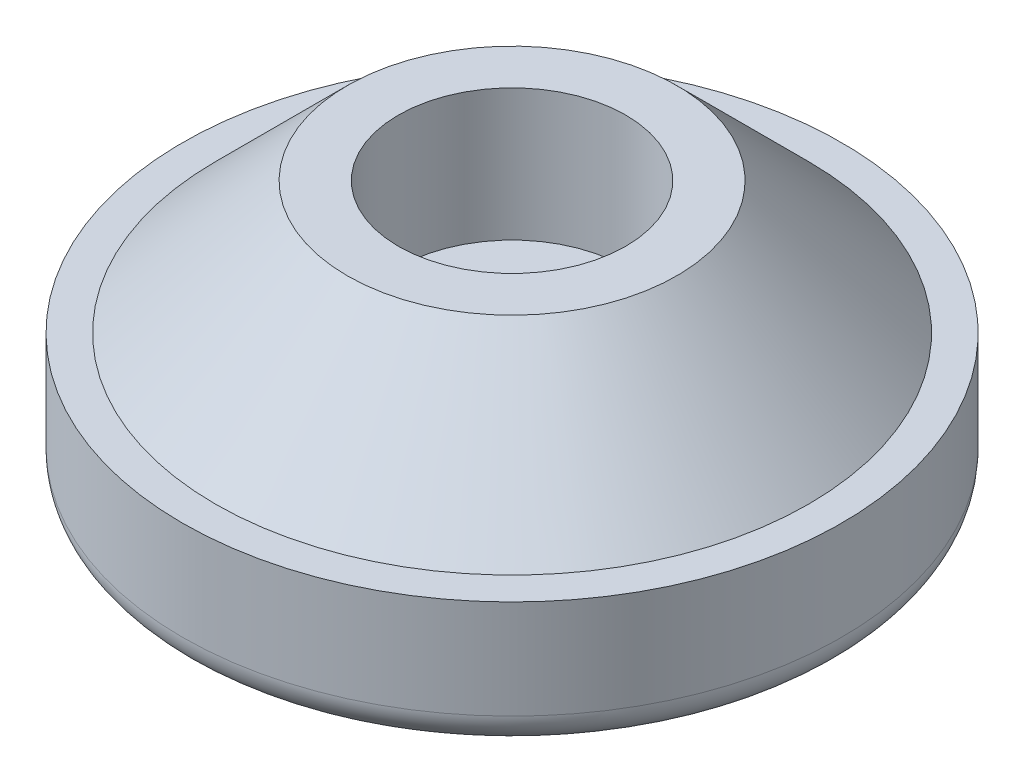
ISO-10303-21;
HEADER;
FILE_DESCRIPTION(('STEP AP214'),'2;1');
FILE_NAME('part.step','',(''),(''),'','','');
FILE_SCHEMA(('AUTOMOTIVE_DESIGN { 1 0 10303 214 1 1 1 1 }'));
ENDSEC;
DATA;
#1=APPLICATION_CONTEXT('core data for automotive mechanical design processes');
#2=APPLICATION_PROTOCOL_DEFINITION('international standard','automotive_design',2000,#1);
#3=PRODUCT_CONTEXT('',#1,'mechanical');
#4=PRODUCT('Part','Part','',(#3));
#5=PRODUCT_RELATED_PRODUCT_CATEGORY('part','',(#4));
#6=PRODUCT_DEFINITION_FORMATION('','',#4);
#7=PRODUCT_DEFINITION_CONTEXT('part definition',#1,'design');
#8=PRODUCT_DEFINITION('design','',#6,#7);
#9=PRODUCT_DEFINITION_SHAPE('','',#8);
#10=(LENGTH_UNIT() NAMED_UNIT(*) SI_UNIT(.MILLI.,.METRE.));
#11=(NAMED_UNIT(*) PLANE_ANGLE_UNIT() SI_UNIT($,.RADIAN.));
#12=(NAMED_UNIT(*) SI_UNIT($,.STERADIAN.) SOLID_ANGLE_UNIT());
#13=UNCERTAINTY_MEASURE_WITH_UNIT(LENGTH_MEASURE(1.E-05),#10,'distance_accuracy_value','');
#14=(GEOMETRIC_REPRESENTATION_CONTEXT(3) GLOBAL_UNCERTAINTY_ASSIGNED_CONTEXT((#13)) GLOBAL_UNIT_ASSIGNED_CONTEXT((#10,
#11,#12)) REPRESENTATION_CONTEXT('',''));
#15=CARTESIAN_POINT('',(0.,0.,0.));
#16=DIRECTION('',(0.,0.,1.));
#17=DIRECTION('',(1.,0.,0.));
#18=AXIS2_PLACEMENT_3D('',#15,#16,#17);
#19=CARTESIAN_POINT('',(0.,0.5,0.));
#20=DIRECTION('',(0.,1.,0.));
#21=DIRECTION('',(0.,0.,1.));
#22=AXIS2_PLACEMENT_3D('',#19,#20,#21);
#23=TOROIDAL_SURFACE('',#22,4.5,0.5);
#24=CARTESIAN_POINT('',(0.,0.5,0.));
#25=DIRECTION('',(0.,1.,0.));
#26=DIRECTION('',(0.,0.,1.));
#27=AXIS2_PLACEMENT_3D('',#24,#25,#26);
#28=CIRCLE('',#27,5.);
#29=CARTESIAN_POINT('',(0.,0.5,5.));
#30=VERTEX_POINT('',#29);
#31=EDGE_CURVE('E37',#30,#30,#28,.T.);
#32=ORIENTED_EDGE('',*,*,#31,.F.);
#33=EDGE_LOOP('',(#32));
#34=FACE_BOUND('',#33,.T.);
#35=CARTESIAN_POINT('',(0.,0.,0.));
#36=DIRECTION('',(0.,1.,0.));
#37=DIRECTION('',(0.,0.,1.));
#38=AXIS2_PLACEMENT_3D('',#35,#36,#37);
#39=CIRCLE('',#38,4.5);
#40=CARTESIAN_POINT('',(0.,0.,4.5));
#41=VERTEX_POINT('',#40);
#42=EDGE_CURVE('E10',#41,#41,#39,.F.);
#43=ORIENTED_EDGE('',*,*,#42,.F.);
#44=EDGE_LOOP('',(#43));
#45=FACE_BOUND('',#44,.T.);
#46=ADVANCED_FACE('F31',(#34,#45),#23,.T.);
#47=CARTESIAN_POINT('',(0.,2.,0.));
#48=DIRECTION('',(0.,-1.,0.));
#49=DIRECTION('',(0.,0.,-1.));
#50=AXIS2_PLACEMENT_3D('',#47,#48,#49);
#51=CYLINDRICAL_SURFACE('',#50,5.);
#52=ORIENTED_EDGE('',*,*,#31,.T.);
#53=EDGE_LOOP('',(#52));
#54=FACE_BOUND('',#53,.T.);
#55=CARTESIAN_POINT('',(0.,2.,0.));
#56=DIRECTION('',(0.,1.,0.));
#57=DIRECTION('',(0.,0.,1.));
#58=AXIS2_PLACEMENT_3D('',#55,#56,#57);
#59=CIRCLE('',#58,5.);
#60=CARTESIAN_POINT('',(0.,2.,5.));
#61=VERTEX_POINT('',#60);
#62=EDGE_CURVE('E45',#61,#61,#59,.T.);
#63=ORIENTED_EDGE('',*,*,#62,.F.);
#64=EDGE_LOOP('',(#63));
#65=FACE_BOUND('',#64,.T.);
#66=ADVANCED_FACE('F85',(#54,#65),#51,.T.);
#67=CARTESIAN_POINT('',(0.,2.,0.));
#68=DIRECTION('',(0.,1.,0.));
#69=DIRECTION('',(0.,0.,1.));
#70=AXIS2_PLACEMENT_3D('',#67,#68,#69);
#71=PLANE('',#70);
#72=CARTESIAN_POINT('',(0.,2.,0.));
#73=DIRECTION('',(0.,1.,0.));
#74=DIRECTION('',(0.,0.,1.));
#75=AXIS2_PLACEMENT_3D('',#72,#73,#74);
#76=CIRCLE('',#75,4.49999999999999);
#77=CARTESIAN_POINT('',(0.,2.,4.49999999999999));
#78=VERTEX_POINT('',#77);
#79=EDGE_CURVE('E41',#78,#78,#76,.F.);
#80=ORIENTED_EDGE('',*,*,#79,.T.);
#81=EDGE_LOOP('',(#80));
#82=FACE_BOUND('',#81,.T.);
#83=ORIENTED_EDGE('',*,*,#62,.T.);
#84=EDGE_LOOP('',(#83));
#85=FACE_BOUND('',#84,.T.);
#86=ADVANCED_FACE('F90',(#82,#85),#71,.T.);
#87=CARTESIAN_POINT('',(0.,0.,0.));
#88=DIRECTION('',(0.,1.,0.));
#89=DIRECTION('',(0.,0.,1.));
#90=AXIS2_PLACEMENT_3D('',#87,#88,#89);
#91=PLANE('',#90);
#92=ORIENTED_EDGE('',*,*,#42,.T.);
#93=EDGE_LOOP('',(#92));
#94=FACE_BOUND('',#93,.T.);
#95=ADVANCED_FACE('F71',(#94),#91,.F.);
#96=CARTESIAN_POINT('',(0.,4.,0.));
#97=DIRECTION('',(0.,1.,0.));
#98=DIRECTION('',(0.,0.,1.));
#99=AXIS2_PLACEMENT_3D('',#96,#97,#98);
#100=PLANE('',#99);
#101=CARTESIAN_POINT('',(0.,4.,0.));
#102=DIRECTION('',(0.,1.,0.));
#103=DIRECTION('',(0.,0.,1.));
#104=AXIS2_PLACEMENT_3D('',#101,#102,#103);
#105=CIRCLE('',#104,1.725);
#106=CARTESIAN_POINT('',(0.,4.,1.725));
#107=VERTEX_POINT('',#106);
#108=EDGE_CURVE('E54',#107,#107,#105,.T.);
#109=ORIENTED_EDGE('',*,*,#108,.F.);
#110=EDGE_LOOP('',(#109));
#111=FACE_BOUND('',#110,.T.);
#112=CARTESIAN_POINT('',(0.,4.,0.));
#113=DIRECTION('',(0.,1.,0.));
#114=DIRECTION('',(0.,0.,1.));
#115=AXIS2_PLACEMENT_3D('',#112,#113,#114);
#116=CIRCLE('',#115,2.5);
#117=CARTESIAN_POINT('',(0.,4.,2.5));
#118=VERTEX_POINT('',#117);
#119=EDGE_CURVE('E50',#118,#118,#116,.T.);
#120=ORIENTED_EDGE('',*,*,#119,.T.);
#121=EDGE_LOOP('',(#120));
#122=FACE_BOUND('',#121,.T.);
#123=ADVANCED_FACE('F65',(#111,#122),#100,.T.);
#124=CARTESIAN_POINT('',(0.,2.,0.));
#125=DIRECTION('',(0.,1.,0.));
#126=DIRECTION('',(0.,0.,1.));
#127=AXIS2_PLACEMENT_3D('',#124,#125,#126);
#128=CYLINDRICAL_SURFACE('',#127,1.725);
#129=CARTESIAN_POINT('',(0.,2.,0.));
#130=DIRECTION('',(0.,1.,0.));
#131=DIRECTION('',(0.,0.,1.));
#132=AXIS2_PLACEMENT_3D('',#129,#130,#131);
#133=CIRCLE('',#132,1.725);
#134=CARTESIAN_POINT('',(0.,2.,1.725));
#135=VERTEX_POINT('',#134);
#136=EDGE_CURVE('E53',#135,#135,#133,.T.);
#137=ORIENTED_EDGE('',*,*,#136,.F.);
#138=EDGE_LOOP('',(#137));
#139=FACE_BOUND('',#138,.T.);
#140=ORIENTED_EDGE('',*,*,#108,.T.);
#141=EDGE_LOOP('',(#140));
#142=FACE_BOUND('',#141,.T.);
#143=ADVANCED_FACE('F62',(#139,#142),#128,.F.);
#144=CARTESIAN_POINT('',(0.,2.,0.));
#145=DIRECTION('',(0.,1.,0.));
#146=DIRECTION('',(0.,0.,1.));
#147=AXIS2_PLACEMENT_3D('',#144,#145,#146);
#148=PLANE('',#147);
#149=ORIENTED_EDGE('',*,*,#136,.T.);
#150=EDGE_LOOP('',(#149));
#151=FACE_BOUND('',#150,.T.);
#152=ADVANCED_FACE('F60',(#151),#148,.T.);
#153=CARTESIAN_POINT('',(0.,4.00000000000001,0.));
#154=DIRECTION('',(0.,-1.,0.));
#155=DIRECTION('',(0.,0.,-1.));
#156=AXIS2_PLACEMENT_3D('',#153,#154,#155);
#157=CONICAL_SURFACE('',#156,2.5,0.785398163397443);
#158=ORIENTED_EDGE('',*,*,#79,.F.);
#159=EDGE_LOOP('',(#158));
#160=FACE_BOUND('',#159,.T.);
#161=ORIENTED_EDGE('',*,*,#119,.F.);
#162=EDGE_LOOP('',(#161));
#163=FACE_BOUND('',#162,.T.);
#164=ADVANCED_FACE('F75',(#160,#163),#157,.T.);
#165=CLOSED_SHELL('',(#46,#66,#86,#95,#123,#143,#152,#164));
#166=MANIFOLD_SOLID_BREP('B2',#165);
#167=ADVANCED_BREP_SHAPE_REPRESENTATION('',(#18,#166),#14);
#168=SHAPE_DEFINITION_REPRESENTATION(#9,#167);
ENDSEC;
END-ISO-10303-21;
